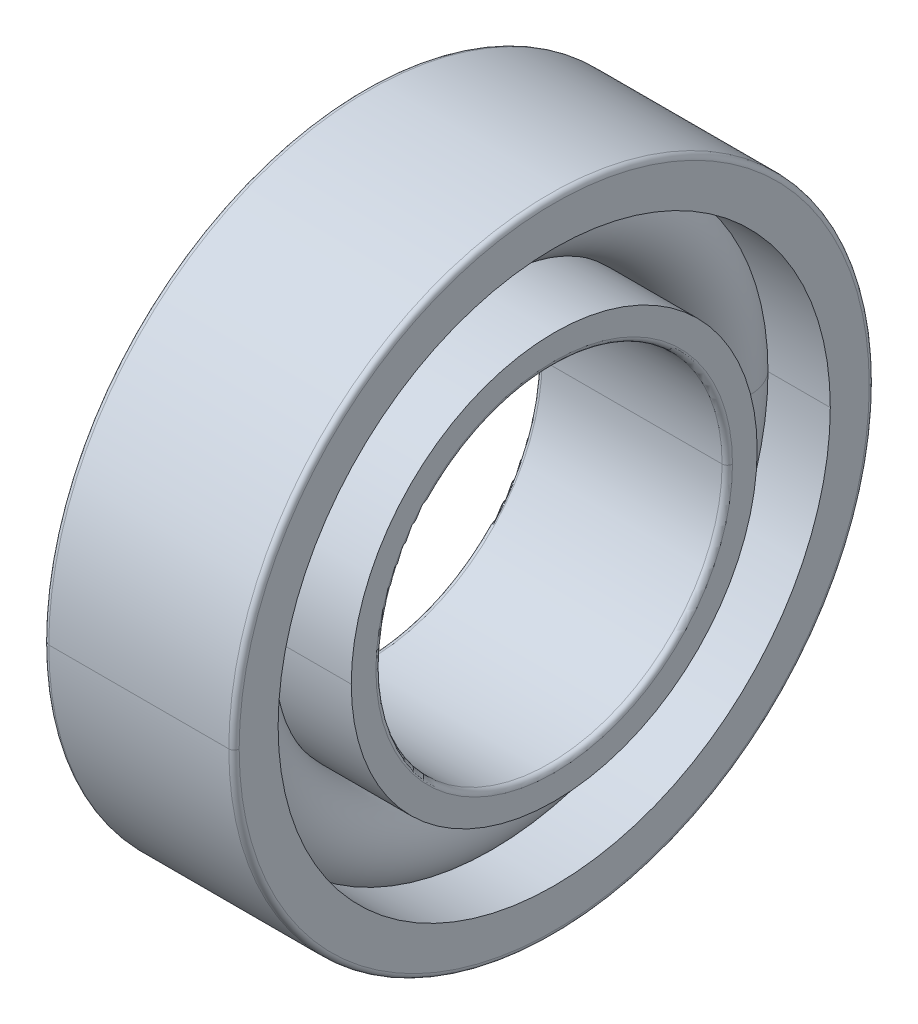
ISO-10303-21;
HEADER;
FILE_DESCRIPTION(('STEP AP214'),'2;1');
FILE_NAME('part.step','',(''),(''),'','','');
FILE_SCHEMA(('AUTOMOTIVE_DESIGN { 1 0 10303 214 1 1 1 1 }'));
ENDSEC;
DATA;
#1=APPLICATION_CONTEXT('core data for automotive mechanical design processes');
#2=APPLICATION_PROTOCOL_DEFINITION('international standard','automotive_design',2000,#1);
#3=PRODUCT_CONTEXT('',#1,'mechanical');
#4=PRODUCT('Part','Part','',(#3));
#5=PRODUCT_RELATED_PRODUCT_CATEGORY('part','',(#4));
#6=PRODUCT_DEFINITION_FORMATION('','',#4);
#7=PRODUCT_DEFINITION_CONTEXT('part definition',#1,'design');
#8=PRODUCT_DEFINITION('design','',#6,#7);
#9=PRODUCT_DEFINITION_SHAPE('','',#8);
#10=(LENGTH_UNIT() NAMED_UNIT(*) SI_UNIT(.MILLI.,.METRE.));
#11=(NAMED_UNIT(*) PLANE_ANGLE_UNIT() SI_UNIT($,.RADIAN.));
#12=(NAMED_UNIT(*) SI_UNIT($,.STERADIAN.) SOLID_ANGLE_UNIT());
#13=UNCERTAINTY_MEASURE_WITH_UNIT(LENGTH_MEASURE(1.E-05),#10,'distance_accuracy_value','');
#14=(GEOMETRIC_REPRESENTATION_CONTEXT(3) GLOBAL_UNCERTAINTY_ASSIGNED_CONTEXT((#13)) GLOBAL_UNIT_ASSIGNED_CONTEXT((#10,
#11,#12)) REPRESENTATION_CONTEXT('',''));
#15=CARTESIAN_POINT('',(0.,0.,0.));
#16=DIRECTION('',(0.,0.,1.));
#17=DIRECTION('',(1.,0.,0.));
#18=AXIS2_PLACEMENT_3D('',#15,#16,#17);
#19=CARTESIAN_POINT('',(-5.5,16.775,0.));
#20=DIRECTION('',(-1.,0.,0.));
#21=DIRECTION('',(0.,0.,1.));
#22=AXIS2_PLACEMENT_3D('',#19,#20,#21);
#23=PLANE('',#22);
#24=CARTESIAN_POINT('',(-5.5,0.,0.));
#25=DIRECTION('',(1.,0.,0.));
#26=DIRECTION('',(0.,0.,-1.));
#27=AXIS2_PLACEMENT_3D('',#24,#25,#26);
#28=CIRCLE('',#27,16.775);
#29=CARTESIAN_POINT('',(-5.5,0.,-16.775));
#30=VERTEX_POINT('',#29);
#31=CARTESIAN_POINT('',(-5.5,0.,16.775));
#32=VERTEX_POINT('',#31);
#33=EDGE_CURVE('E216',#30,#32,#28,.T.);
#34=ORIENTED_EDGE('',*,*,#33,.T.);
#35=CARTESIAN_POINT('',(-5.5,0.,0.));
#36=DIRECTION('',(1.,0.,0.));
#37=DIRECTION('',(0.,0.,-1.));
#38=AXIS2_PLACEMENT_3D('',#35,#36,#37);
#39=CIRCLE('',#38,16.775);
#40=EDGE_CURVE('E164',#32,#30,#39,.T.);
#41=ORIENTED_EDGE('',*,*,#40,.T.);
#42=EDGE_LOOP('',(#34,#41));
#43=FACE_BOUND('',#42,.T.);
#44=CARTESIAN_POINT('',(-5.5,0.,0.));
#45=DIRECTION('',(1.,0.,0.));
#46=DIRECTION('',(0.,0.,-1.));
#47=AXIS2_PLACEMENT_3D('',#44,#45,#46);
#48=CIRCLE('',#47,18.2);
#49=CARTESIAN_POINT('',(-5.5,0.,-18.2));
#50=VERTEX_POINT('',#49);
#51=CARTESIAN_POINT('',(-5.5,0.,18.2));
#52=VERTEX_POINT('',#51);
#53=EDGE_CURVE('E153',#50,#52,#48,.T.);
#54=ORIENTED_EDGE('',*,*,#53,.F.);
#55=CARTESIAN_POINT('',(-5.5,0.,0.));
#56=DIRECTION('',(1.,0.,0.));
#57=DIRECTION('',(0.,0.,-1.));
#58=AXIS2_PLACEMENT_3D('',#55,#56,#57);
#59=CIRCLE('',#58,18.2);
#60=EDGE_CURVE('E212',#52,#50,#59,.T.);
#61=ORIENTED_EDGE('',*,*,#60,.F.);
#62=EDGE_LOOP('',(#54,#61));
#63=FACE_BOUND('',#62,.T.);
#64=ADVANCED_FACE('F17',(#43,#63),#23,.T.);
#65=CARTESIAN_POINT('',(5.5,18.2,0.));
#66=DIRECTION('',(1.,0.,0.));
#67=DIRECTION('',(0.,1.,0.));
#68=AXIS2_PLACEMENT_3D('',#65,#66,#67);
#69=PLANE('',#68);
#70=CARTESIAN_POINT('',(5.5,0.,0.));
#71=DIRECTION('',(1.,0.,0.));
#72=DIRECTION('',(0.,0.,-1.));
#73=AXIS2_PLACEMENT_3D('',#70,#71,#72);
#74=CIRCLE('',#73,15.95);
#75=CARTESIAN_POINT('',(5.5,0.,-15.95));
#76=VERTEX_POINT('',#75);
#77=CARTESIAN_POINT('',(5.5,0.,15.95));
#78=VERTEX_POINT('',#77);
#79=EDGE_CURVE('E194',#76,#78,#74,.T.);
#80=ORIENTED_EDGE('',*,*,#79,.F.);
#81=CARTESIAN_POINT('',(5.5,0.,0.));
#82=DIRECTION('',(1.,0.,0.));
#83=DIRECTION('',(0.,0.,-1.));
#84=AXIS2_PLACEMENT_3D('',#81,#82,#83);
#85=CIRCLE('',#84,15.95);
#86=EDGE_CURVE('E217',#78,#76,#85,.T.);
#87=ORIENTED_EDGE('',*,*,#86,.F.);
#88=EDGE_LOOP('',(#80,#87));
#89=FACE_BOUND('',#88,.T.);
#90=CARTESIAN_POINT('',(5.5,0.,0.));
#91=DIRECTION('',(1.,0.,0.));
#92=DIRECTION('',(0.,0.,-1.));
#93=AXIS2_PLACEMENT_3D('',#90,#91,#92);
#94=CIRCLE('',#93,18.2);
#95=CARTESIAN_POINT('',(5.5,0.,-18.2));
#96=VERTEX_POINT('',#95);
#97=CARTESIAN_POINT('',(5.5,0.,18.2));
#98=VERTEX_POINT('',#97);
#99=EDGE_CURVE('E190',#96,#98,#94,.T.);
#100=ORIENTED_EDGE('',*,*,#99,.T.);
#101=CARTESIAN_POINT('',(5.5,0.,0.));
#102=DIRECTION('',(1.,0.,0.));
#103=DIRECTION('',(0.,0.,-1.));
#104=AXIS2_PLACEMENT_3D('',#101,#102,#103);
#105=CIRCLE('',#104,18.2);
#106=EDGE_CURVE('E11',#98,#96,#105,.T.);
#107=ORIENTED_EDGE('',*,*,#106,.T.);
#108=EDGE_LOOP('',(#100,#107));
#109=FACE_BOUND('',#108,.T.);
#110=ADVANCED_FACE('F460',(#89,#109),#69,.T.);
#111=CARTESIAN_POINT('',(5.2,0.,0.));
#112=DIRECTION('',(1.,0.,0.));
#113=DIRECTION('',(0.,0.,-1.));
#114=AXIS2_PLACEMENT_3D('',#111,#112,#113);
#115=TOROIDAL_SURFACE('',#114,18.2,0.3);
#116=CARTESIAN_POINT('',(5.2,0.,18.2));
#117=DIRECTION('',(0.,1.,0.));
#118=DIRECTION('',(0.,0.,1.));
#119=AXIS2_PLACEMENT_3D('',#116,#117,#118);
#120=CIRCLE('',#119,0.3);
#121=CARTESIAN_POINT('',(5.2,0.,18.5));
#122=VERTEX_POINT('',#121);
#123=EDGE_CURVE('E179',#122,#98,#120,.T.);
#124=ORIENTED_EDGE('',*,*,#123,.F.);
#125=CARTESIAN_POINT('',(5.2,0.,0.));
#126=DIRECTION('',(1.,0.,0.));
#127=DIRECTION('',(0.,0.,-1.));
#128=AXIS2_PLACEMENT_3D('',#125,#126,#127);
#129=CIRCLE('',#128,18.5);
#130=CARTESIAN_POINT('',(5.2,0.,-18.5));
#131=VERTEX_POINT('',#130);
#132=EDGE_CURVE('E27',#122,#131,#129,.T.);
#133=ORIENTED_EDGE('',*,*,#132,.T.);
#134=CARTESIAN_POINT('',(5.2,0.,-18.2));
#135=DIRECTION('',(0.,-1.,0.));
#136=DIRECTION('',(0.,0.,-1.));
#137=AXIS2_PLACEMENT_3D('',#134,#135,#136);
#138=CIRCLE('',#137,0.3);
#139=EDGE_CURVE('E185',#131,#96,#138,.T.);
#140=ORIENTED_EDGE('',*,*,#139,.T.);
#141=ORIENTED_EDGE('',*,*,#106,.F.);
#142=EDGE_LOOP('',(#124,#133,#140,#141));
#143=FACE_BOUND('',#142,.T.);
#144=ADVANCED_FACE('F401',(#143),#115,.T.);
#145=CARTESIAN_POINT('',(-20.6375,0.,0.));
#146=DIRECTION('',(1.,0.,0.));
#147=DIRECTION('',(0.,0.,-1.));
#148=AXIS2_PLACEMENT_3D('',#145,#146,#147);
#149=CYLINDRICAL_SURFACE('',#148,18.5);
#150=DIRECTION('',(1.,0.,0.));
#151=VECTOR('',#150,1.);
#152=CARTESIAN_POINT('',(-20.6375,0.,18.5));
#153=LINE('',#152,#151);
#154=CARTESIAN_POINT('',(-5.2,0.,18.5));
#155=VERTEX_POINT('',#154);
#156=EDGE_CURVE('E226',#155,#122,#153,.T.);
#157=ORIENTED_EDGE('',*,*,#156,.F.);
#158=CARTESIAN_POINT('',(-5.2,0.,0.));
#159=DIRECTION('',(1.,0.,0.));
#160=DIRECTION('',(0.,0.,-1.));
#161=AXIS2_PLACEMENT_3D('',#158,#159,#160);
#162=CIRCLE('',#161,18.5);
#163=CARTESIAN_POINT('',(-5.2,0.,-18.5));
#164=VERTEX_POINT('',#163);
#165=EDGE_CURVE('E211',#155,#164,#162,.T.);
#166=ORIENTED_EDGE('',*,*,#165,.T.);
#167=DIRECTION('',(1.,0.,0.));
#168=VECTOR('',#167,1.);
#169=CARTESIAN_POINT('',(-20.6375,0.,-18.5));
#170=LINE('',#169,#168);
#171=EDGE_CURVE('E158',#164,#131,#170,.T.);
#172=ORIENTED_EDGE('',*,*,#171,.T.);
#173=ORIENTED_EDGE('',*,*,#132,.F.);
#174=EDGE_LOOP('',(#157,#166,#172,#173));
#175=FACE_BOUND('',#174,.T.);
#176=ADVANCED_FACE('F407',(#175),#149,.T.);
#177=CARTESIAN_POINT('',(-5.2,0.,0.));
#178=DIRECTION('',(1.,0.,0.));
#179=DIRECTION('',(0.,0.,-1.));
#180=AXIS2_PLACEMENT_3D('',#177,#178,#179);
#181=TOROIDAL_SURFACE('',#180,18.2,0.3);
#182=CARTESIAN_POINT('',(-5.2,0.,18.2));
#183=DIRECTION('',(0.,1.,0.));
#184=DIRECTION('',(0.,0.,1.));
#185=AXIS2_PLACEMENT_3D('',#182,#183,#184);
#186=CIRCLE('',#185,0.3);
#187=EDGE_CURVE('E157',#52,#155,#186,.T.);
#188=ORIENTED_EDGE('',*,*,#187,.F.);
#189=ORIENTED_EDGE('',*,*,#60,.T.);
#190=CARTESIAN_POINT('',(-5.2,0.,-18.2));
#191=DIRECTION('',(0.,-1.,0.));
#192=DIRECTION('',(0.,0.,-1.));
#193=AXIS2_PLACEMENT_3D('',#190,#191,#192);
#194=CIRCLE('',#193,0.3);
#195=EDGE_CURVE('E207',#50,#164,#194,.T.);
#196=ORIENTED_EDGE('',*,*,#195,.T.);
#197=ORIENTED_EDGE('',*,*,#165,.F.);
#198=EDGE_LOOP('',(#188,#189,#196,#197));
#199=FACE_BOUND('',#198,.T.);
#200=ADVANCED_FACE('F473',(#199),#181,.T.);
#201=CARTESIAN_POINT('',(-20.6375,0.,0.));
#202=DIRECTION('',(1.,0.,0.));
#203=DIRECTION('',(0.,0.,-1.));
#204=AXIS2_PLACEMENT_3D('',#201,#202,#203);
#205=CYLINDRICAL_SURFACE('',#204,16.775);
#206=DIRECTION('',(1.,0.,0.));
#207=VECTOR('',#206,1.);
#208=CARTESIAN_POINT('',(-20.6375,0.,16.775));
#209=LINE('',#208,#207);
#210=CARTESIAN_POINT('',(-0.356195171219364,0.,16.775));
#211=VERTEX_POINT('',#210);
#212=EDGE_CURVE('E159',#32,#211,#209,.T.);
#213=ORIENTED_EDGE('',*,*,#212,.F.);
#214=ORIENTED_EDGE('',*,*,#33,.F.);
#215=DIRECTION('',(1.,0.,0.));
#216=VECTOR('',#215,1.);
#217=CARTESIAN_POINT('',(-20.6375,0.,-16.775));
#218=LINE('',#217,#216);
#219=CARTESIAN_POINT('',(-0.356195171219364,0.,-16.775));
#220=VERTEX_POINT('',#219);
#221=EDGE_CURVE('E238',#30,#220,#218,.T.);
#222=ORIENTED_EDGE('',*,*,#221,.T.);
#223=CARTESIAN_POINT('',(-0.356195171219364,0.,0.));
#224=DIRECTION('',(-1.,0.,0.));
#225=DIRECTION('',(0.,0.,-1.));
#226=AXIS2_PLACEMENT_3D('',#223,#224,#225);
#227=CIRCLE('',#226,16.775);
#228=EDGE_CURVE('E202',#211,#220,#227,.T.);
#229=ORIENTED_EDGE('',*,*,#228,.F.);
#230=EDGE_LOOP('',(#213,#214,#222,#229));
#231=FACE_BOUND('',#230,.T.);
#232=ADVANCED_FACE('F475',(#231),#205,.F.);
#233=CARTESIAN_POINT('',(-20.6375,0.,0.));
#234=DIRECTION('',(1.,0.,0.));
#235=DIRECTION('',(0.,0.,-1.));
#236=AXIS2_PLACEMENT_3D('',#233,#234,#235);
#237=CYLINDRICAL_SURFACE('',#236,15.95);
#238=DIRECTION('',(1.,0.,0.));
#239=VECTOR('',#238,1.);
#240=CARTESIAN_POINT('',(-20.6375,0.,15.95));
#241=LINE('',#240,#239);
#242=CARTESIAN_POINT('',(1.90065778087482,0.,15.95));
#243=VERTEX_POINT('',#242);
#244=EDGE_CURVE('E222',#243,#78,#241,.T.);
#245=ORIENTED_EDGE('',*,*,#244,.F.);
#246=CARTESIAN_POINT('',(1.90065778087482,0.,0.));
#247=DIRECTION('',(1.,0.,0.));
#248=DIRECTION('',(0.,0.,1.));
#249=AXIS2_PLACEMENT_3D('',#246,#247,#248);
#250=CIRCLE('',#249,15.95);
#251=CARTESIAN_POINT('',(1.90065778087482,0.,-15.95));
#252=VERTEX_POINT('',#251);
#253=EDGE_CURVE('E174',#252,#243,#250,.T.);
#254=ORIENTED_EDGE('',*,*,#253,.F.);
#255=DIRECTION('',(1.,0.,0.));
#256=VECTOR('',#255,1.);
#257=CARTESIAN_POINT('',(-20.6375,0.,-15.95));
#258=LINE('',#257,#256);
#259=EDGE_CURVE('E221',#252,#76,#258,.T.);
#260=ORIENTED_EDGE('',*,*,#259,.T.);
#261=ORIENTED_EDGE('',*,*,#79,.T.);
#262=EDGE_LOOP('',(#245,#254,#260,#261));
#263=FACE_BOUND('',#262,.T.);
#264=ADVANCED_FACE('F481',(#263),#237,.F.);
#265=CARTESIAN_POINT('',(0.,0.,0.));
#266=DIRECTION('',(-1.,0.,0.));
#267=DIRECTION('',(0.,0.,1.));
#268=AXIS2_PLACEMENT_3D('',#265,#266,#267);
#269=TOROIDAL_SURFACE('',#268,14.25,2.55);
#270=CARTESIAN_POINT('',(0.,0.,-14.25));
#271=DIRECTION('',(0.,1.,0.));
#272=DIRECTION('',(0.,0.,1.));
#273=AXIS2_PLACEMENT_3D('',#270,#271,#272);
#274=CIRCLE('',#273,2.55);
#275=CARTESIAN_POINT('',(-1.90065778087482,0.,-12.55));
#276=VERTEX_POINT('',#275);
#277=EDGE_CURVE('E198',#220,#276,#274,.T.);
#278=ORIENTED_EDGE('',*,*,#277,.F.);
#279=CARTESIAN_POINT('',(-0.356195171219364,0.,0.));
#280=DIRECTION('',(-1.,0.,0.));
#281=DIRECTION('',(0.,0.,-1.));
#282=AXIS2_PLACEMENT_3D('',#279,#280,#281);
#283=CIRCLE('',#282,16.775);
#284=EDGE_CURVE('E163',#220,#211,#283,.T.);
#285=ORIENTED_EDGE('',*,*,#284,.T.);
#286=CARTESIAN_POINT('',(0.,0.,14.25));
#287=DIRECTION('',(0.,-1.,0.));
#288=DIRECTION('',(0.,0.,-1.));
#289=AXIS2_PLACEMENT_3D('',#286,#287,#288);
#290=CIRCLE('',#289,2.55);
#291=CARTESIAN_POINT('',(-1.90065778087482,0.,12.55));
#292=VERTEX_POINT('',#291);
#293=EDGE_CURVE('E252',#211,#292,#290,.T.);
#294=ORIENTED_EDGE('',*,*,#293,.T.);
#295=CARTESIAN_POINT('',(-1.90065778087482,0.,0.));
#296=DIRECTION('',(1.,0.,0.));
#297=DIRECTION('',(0.,0.,-1.));
#298=AXIS2_PLACEMENT_3D('',#295,#296,#297);
#299=CIRCLE('',#298,12.55);
#300=EDGE_CURVE('E147',#292,#276,#299,.T.);
#301=ORIENTED_EDGE('',*,*,#300,.T.);
#302=EDGE_LOOP('',(#278,#285,#294,#301));
#303=FACE_BOUND('',#302,.T.);
#304=ADVANCED_FACE('F347',(#303),#269,.T.);
#305=CARTESIAN_POINT('',(-5.5,12.55,0.));
#306=DIRECTION('',(-1.,0.,0.));
#307=DIRECTION('',(0.,0.,1.));
#308=AXIS2_PLACEMENT_3D('',#305,#306,#307);
#309=PLANE('',#308);
#310=CARTESIAN_POINT('',(-5.5,0.,0.));
#311=DIRECTION('',(1.,0.,0.));
#312=DIRECTION('',(0.,0.,-1.));
#313=AXIS2_PLACEMENT_3D('',#310,#311,#312);
#314=CIRCLE('',#313,10.3);
#315=CARTESIAN_POINT('',(-5.5,0.,-10.3));
#316=VERTEX_POINT('',#315);
#317=CARTESIAN_POINT('',(-5.5,0.,10.3));
#318=VERTEX_POINT('',#317);
#319=EDGE_CURVE('E275',#316,#318,#314,.T.);
#320=ORIENTED_EDGE('',*,*,#319,.T.);
#321=CARTESIAN_POINT('',(-5.5,0.,0.));
#322=DIRECTION('',(1.,0.,0.));
#323=DIRECTION('',(0.,0.,-1.));
#324=AXIS2_PLACEMENT_3D('',#321,#322,#323);
#325=CIRCLE('',#324,10.3);
#326=EDGE_CURVE('E191',#318,#316,#325,.T.);
#327=ORIENTED_EDGE('',*,*,#326,.T.);
#328=EDGE_LOOP('',(#320,#327));
#329=FACE_BOUND('',#328,.T.);
#330=CARTESIAN_POINT('',(-5.5,0.,0.));
#331=DIRECTION('',(1.,0.,0.));
#332=DIRECTION('',(0.,0.,-1.));
#333=AXIS2_PLACEMENT_3D('',#330,#331,#332);
#334=CIRCLE('',#333,12.55);
#335=CARTESIAN_POINT('',(-5.5,0.,-12.55));
#336=VERTEX_POINT('',#335);
#337=CARTESIAN_POINT('',(-5.5,0.,12.55));
#338=VERTEX_POINT('',#337);
#339=EDGE_CURVE('E180',#336,#338,#334,.T.);
#340=ORIENTED_EDGE('',*,*,#339,.F.);
#341=CARTESIAN_POINT('',(-5.5,0.,0.));
#342=DIRECTION('',(1.,0.,0.));
#343=DIRECTION('',(0.,0.,-1.));
#344=AXIS2_PLACEMENT_3D('',#341,#342,#343);
#345=CIRCLE('',#344,12.55);
#346=EDGE_CURVE('E323',#338,#336,#345,.T.);
#347=ORIENTED_EDGE('',*,*,#346,.F.);
#348=EDGE_LOOP('',(#340,#347));
#349=FACE_BOUND('',#348,.T.);
#350=ADVANCED_FACE('F344',(#329,#349),#309,.T.);
#351=CARTESIAN_POINT('',(-5.2,0.,0.));
#352=DIRECTION('',(1.,0.,0.));
#353=DIRECTION('',(0.,0.,-1.));
#354=AXIS2_PLACEMENT_3D('',#351,#352,#353);
#355=TOROIDAL_SURFACE('',#354,10.3,0.3);
#356=CARTESIAN_POINT('',(-5.2,0.,10.3));
#357=DIRECTION('',(0.,1.,0.));
#358=DIRECTION('',(0.,0.,1.));
#359=AXIS2_PLACEMENT_3D('',#356,#357,#358);
#360=CIRCLE('',#359,0.299999999999996);
#361=CARTESIAN_POINT('',(-5.2,0.,10.));
#362=VERTEX_POINT('',#361);
#363=EDGE_CURVE('E251',#362,#318,#360,.T.);
#364=ORIENTED_EDGE('',*,*,#363,.F.);
#365=CARTESIAN_POINT('',(-5.2,0.,0.));
#366=DIRECTION('',(1.,0.,0.));
#367=DIRECTION('',(0.,0.,-1.));
#368=AXIS2_PLACEMENT_3D('',#365,#366,#367);
#369=CIRCLE('',#368,10.);
#370=CARTESIAN_POINT('',(-5.2,0.,-10.));
#371=VERTEX_POINT('',#370);
#372=EDGE_CURVE('E134',#362,#371,#369,.T.);
#373=ORIENTED_EDGE('',*,*,#372,.T.);
#374=CARTESIAN_POINT('',(-5.2,0.,-10.3));
#375=DIRECTION('',(0.,-1.,0.));
#376=DIRECTION('',(0.,0.,-1.));
#377=AXIS2_PLACEMENT_3D('',#374,#375,#376);
#378=CIRCLE('',#377,0.299999999999996);
#379=EDGE_CURVE('E143',#371,#316,#378,.T.);
#380=ORIENTED_EDGE('',*,*,#379,.T.);
#381=ORIENTED_EDGE('',*,*,#326,.F.);
#382=EDGE_LOOP('',(#364,#373,#380,#381));
#383=FACE_BOUND('',#382,.T.);
#384=ADVANCED_FACE('F340',(#383),#355,.T.);
#385=CARTESIAN_POINT('',(-20.6375,0.,0.));
#386=DIRECTION('',(1.,0.,0.));
#387=DIRECTION('',(0.,0.,-1.));
#388=AXIS2_PLACEMENT_3D('',#385,#386,#387);
#389=CYLINDRICAL_SURFACE('',#388,10.);
#390=DIRECTION('',(1.,0.,0.));
#391=VECTOR('',#390,1.);
#392=CARTESIAN_POINT('',(-20.6375,0.,10.));
#393=LINE('',#392,#391);
#394=CARTESIAN_POINT('',(5.2,0.,10.));
#395=VERTEX_POINT('',#394);
#396=EDGE_CURVE('E108',#362,#395,#393,.T.);
#397=ORIENTED_EDGE('',*,*,#396,.F.);
#398=CARTESIAN_POINT('',(-5.2,0.,0.));
#399=DIRECTION('',(1.,0.,0.));
#400=DIRECTION('',(0.,0.,-1.));
#401=AXIS2_PLACEMENT_3D('',#398,#399,#400);
#402=CIRCLE('',#401,10.);
#403=EDGE_CURVE('E247',#371,#362,#402,.T.);
#404=ORIENTED_EDGE('',*,*,#403,.F.);
#405=DIRECTION('',(1.,0.,0.));
#406=VECTOR('',#405,1.);
#407=CARTESIAN_POINT('',(-20.6375,0.,-10.));
#408=LINE('',#407,#406);
#409=CARTESIAN_POINT('',(5.2,0.,-10.));
#410=VERTEX_POINT('',#409);
#411=EDGE_CURVE('E111',#371,#410,#408,.T.);
#412=ORIENTED_EDGE('',*,*,#411,.T.);
#413=CARTESIAN_POINT('',(5.2,0.,0.));
#414=DIRECTION('',(1.,0.,0.));
#415=DIRECTION('',(0.,0.,-1.));
#416=AXIS2_PLACEMENT_3D('',#413,#414,#415);
#417=CIRCLE('',#416,10.);
#418=EDGE_CURVE('E103',#410,#395,#417,.T.);
#419=ORIENTED_EDGE('',*,*,#418,.T.);
#420=EDGE_LOOP('',(#397,#404,#412,#419));
#421=FACE_BOUND('',#420,.T.);
#422=ADVANCED_FACE('F105',(#421),#389,.F.);
#423=CARTESIAN_POINT('',(5.2,0.,0.));
#424=DIRECTION('',(1.,0.,0.));
#425=DIRECTION('',(0.,0.,-1.));
#426=AXIS2_PLACEMENT_3D('',#423,#424,#425);
#427=TOROIDAL_SURFACE('',#426,10.3,0.3);
#428=CARTESIAN_POINT('',(5.2,0.,10.3));
#429=DIRECTION('',(0.,1.,0.));
#430=DIRECTION('',(0.,0.,1.));
#431=AXIS2_PLACEMENT_3D('',#428,#429,#430);
#432=CIRCLE('',#431,0.299999999999996);
#433=CARTESIAN_POINT('',(5.5,0.,10.3));
#434=VERTEX_POINT('',#433);
#435=EDGE_CURVE('E116',#434,#395,#432,.T.);
#436=ORIENTED_EDGE('',*,*,#435,.F.);
#437=CARTESIAN_POINT('',(5.5,0.,0.));
#438=DIRECTION('',(1.,0.,0.));
#439=DIRECTION('',(0.,0.,-1.));
#440=AXIS2_PLACEMENT_3D('',#437,#438,#439);
#441=CIRCLE('',#440,10.3);
#442=CARTESIAN_POINT('',(5.5,0.,-10.3));
#443=VERTEX_POINT('',#442);
#444=EDGE_CURVE('E195',#434,#443,#441,.T.);
#445=ORIENTED_EDGE('',*,*,#444,.T.);
#446=CARTESIAN_POINT('',(5.2,0.,-10.3));
#447=DIRECTION('',(0.,-1.,0.));
#448=DIRECTION('',(0.,0.,-1.));
#449=AXIS2_PLACEMENT_3D('',#446,#447,#448);
#450=CIRCLE('',#449,0.299999999999996);
#451=EDGE_CURVE('E20',#443,#410,#450,.T.);
#452=ORIENTED_EDGE('',*,*,#451,.T.);
#453=CARTESIAN_POINT('',(5.2,0.,0.));
#454=DIRECTION('',(1.,0.,0.));
#455=DIRECTION('',(0.,0.,-1.));
#456=AXIS2_PLACEMENT_3D('',#453,#454,#455);
#457=CIRCLE('',#456,10.);
#458=EDGE_CURVE('E127',#395,#410,#457,.T.);
#459=ORIENTED_EDGE('',*,*,#458,.F.);
#460=EDGE_LOOP('',(#436,#445,#452,#459));
#461=FACE_BOUND('',#460,.T.);
#462=ADVANCED_FACE('F128',(#461),#427,.T.);
#463=CARTESIAN_POINT('',(5.5,10.3,0.));
#464=DIRECTION('',(1.,0.,0.));
#465=DIRECTION('',(0.,1.,0.));
#466=AXIS2_PLACEMENT_3D('',#463,#464,#465);
#467=PLANE('',#466);
#468=CARTESIAN_POINT('',(5.5,0.,0.));
#469=DIRECTION('',(1.,0.,0.));
#470=DIRECTION('',(0.,0.,-1.));
#471=AXIS2_PLACEMENT_3D('',#468,#469,#470);
#472=CIRCLE('',#471,10.3);
#473=EDGE_CURVE('E122',#443,#434,#472,.T.);
#474=ORIENTED_EDGE('',*,*,#473,.F.);
#475=ORIENTED_EDGE('',*,*,#444,.F.);
#476=EDGE_LOOP('',(#474,#475));
#477=FACE_BOUND('',#476,.T.);
#478=CARTESIAN_POINT('',(5.5,0.,0.));
#479=DIRECTION('',(1.,0.,0.));
#480=DIRECTION('',(0.,0.,-1.));
#481=AXIS2_PLACEMENT_3D('',#478,#479,#480);
#482=CIRCLE('',#481,11.725);
#483=CARTESIAN_POINT('',(5.5,0.,-11.725));
#484=VERTEX_POINT('',#483);
#485=CARTESIAN_POINT('',(5.5,0.,11.725));
#486=VERTEX_POINT('',#485);
#487=EDGE_CURVE('E149',#484,#486,#482,.T.);
#488=ORIENTED_EDGE('',*,*,#487,.T.);
#489=CARTESIAN_POINT('',(5.5,0.,0.));
#490=DIRECTION('',(1.,0.,0.));
#491=DIRECTION('',(0.,0.,-1.));
#492=AXIS2_PLACEMENT_3D('',#489,#490,#491);
#493=CIRCLE('',#492,11.725);
#494=EDGE_CURVE('E41',#486,#484,#493,.T.);
#495=ORIENTED_EDGE('',*,*,#494,.T.);
#496=EDGE_LOOP('',(#488,#495));
#497=FACE_BOUND('',#496,.T.);
#498=ADVANCED_FACE('F429',(#477,#497),#467,.T.);
#499=CARTESIAN_POINT('',(-20.6375,0.,0.));
#500=DIRECTION('',(1.,0.,0.));
#501=DIRECTION('',(0.,0.,-1.));
#502=AXIS2_PLACEMENT_3D('',#499,#500,#501);
#503=CYLINDRICAL_SURFACE('',#502,12.55);
#504=DIRECTION('',(1.,0.,0.));
#505=VECTOR('',#504,1.);
#506=CARTESIAN_POINT('',(-20.6375,0.,12.55));
#507=LINE('',#506,#505);
#508=EDGE_CURVE('E184',#338,#292,#507,.T.);
#509=ORIENTED_EDGE('',*,*,#508,.F.);
#510=ORIENTED_EDGE('',*,*,#346,.T.);
#511=DIRECTION('',(1.,0.,0.));
#512=VECTOR('',#511,1.);
#513=CARTESIAN_POINT('',(-20.6375,0.,-12.55));
#514=LINE('',#513,#512);
#515=EDGE_CURVE('E169',#336,#276,#514,.T.);
#516=ORIENTED_EDGE('',*,*,#515,.T.);
#517=ORIENTED_EDGE('',*,*,#300,.F.);
#518=EDGE_LOOP('',(#509,#510,#516,#517));
#519=FACE_BOUND('',#518,.T.);
#520=ADVANCED_FACE('F431',(#519),#503,.T.);
#521=CARTESIAN_POINT('',(-20.6375,0.,0.));
#522=DIRECTION('',(1.,0.,0.));
#523=DIRECTION('',(0.,0.,-1.));
#524=AXIS2_PLACEMENT_3D('',#521,#522,#523);
#525=CYLINDRICAL_SURFACE('',#524,11.725);
#526=DIRECTION('',(1.,0.,0.));
#527=VECTOR('',#526,1.);
#528=CARTESIAN_POINT('',(-20.6375,0.,11.725));
#529=LINE('',#528,#527);
#530=CARTESIAN_POINT('',(0.356195171219364,0.,11.725));
#531=VERTEX_POINT('',#530);
#532=EDGE_CURVE('E152',#531,#486,#529,.T.);
#533=ORIENTED_EDGE('',*,*,#532,.F.);
#534=CARTESIAN_POINT('',(0.356195171219364,0.,0.));
#535=DIRECTION('',(-1.,0.,0.));
#536=DIRECTION('',(0.,0.,1.));
#537=AXIS2_PLACEMENT_3D('',#534,#535,#536);
#538=CIRCLE('',#537,11.725);
#539=CARTESIAN_POINT('',(0.356195171219364,0.,-11.725));
#540=VERTEX_POINT('',#539);
#541=EDGE_CURVE('E293',#540,#531,#538,.T.);
#542=ORIENTED_EDGE('',*,*,#541,.F.);
#543=DIRECTION('',(1.,0.,0.));
#544=VECTOR('',#543,1.);
#545=CARTESIAN_POINT('',(-20.6375,0.,-11.725));
#546=LINE('',#545,#544);
#547=EDGE_CURVE('E151',#540,#484,#546,.T.);
#548=ORIENTED_EDGE('',*,*,#547,.T.);
#549=ORIENTED_EDGE('',*,*,#494,.F.);
#550=EDGE_LOOP('',(#533,#542,#548,#549));
#551=FACE_BOUND('',#550,.T.);
#552=ADVANCED_FACE('F440',(#551),#525,.T.);
#553=CARTESIAN_POINT('',(0.,0.,0.));
#554=DIRECTION('',(-1.,0.,0.));
#555=DIRECTION('',(0.,0.,1.));
#556=AXIS2_PLACEMENT_3D('',#553,#554,#555);
#557=TOROIDAL_SURFACE('',#556,14.25,2.55);
#558=CARTESIAN_POINT('',(0.,0.,-14.25));
#559=DIRECTION('',(0.,1.,0.));
#560=DIRECTION('',(0.,0.,1.));
#561=AXIS2_PLACEMENT_3D('',#558,#559,#560);
#562=CIRCLE('',#561,2.55);
#563=EDGE_CURVE('E170',#540,#252,#562,.T.);
#564=ORIENTED_EDGE('',*,*,#563,.F.);
#565=ORIENTED_EDGE('',*,*,#541,.T.);
#566=CARTESIAN_POINT('',(0.,0.,14.25));
#567=DIRECTION('',(0.,-1.,0.));
#568=DIRECTION('',(0.,0.,-1.));
#569=AXIS2_PLACEMENT_3D('',#566,#567,#568);
#570=CIRCLE('',#569,2.55);
#571=EDGE_CURVE('E290',#531,#243,#570,.T.);
#572=ORIENTED_EDGE('',*,*,#571,.T.);
#573=CARTESIAN_POINT('',(1.90065778087482,0.,0.));
#574=DIRECTION('',(1.,0.,0.));
#575=DIRECTION('',(0.,0.,1.));
#576=AXIS2_PLACEMENT_3D('',#573,#574,#575);
#577=CIRCLE('',#576,15.95);
#578=EDGE_CURVE('E246',#243,#252,#577,.T.);
#579=ORIENTED_EDGE('',*,*,#578,.T.);
#580=EDGE_LOOP('',(#564,#565,#572,#579));
#581=FACE_BOUND('',#580,.T.);
#582=ADVANCED_FACE('F449',(#581),#557,.T.);
#583=CARTESIAN_POINT('',(0.,0.,0.));
#584=DIRECTION('',(-1.,0.,0.));
#585=DIRECTION('',(0.,0.,1.));
#586=AXIS2_PLACEMENT_3D('',#583,#584,#585);
#587=TOROIDAL_SURFACE('',#586,14.25,2.55);
#588=CARTESIAN_POINT('',(0.356195171219364,0.,0.));
#589=DIRECTION('',(-1.,0.,0.));
#590=DIRECTION('',(0.,0.,1.));
#591=AXIS2_PLACEMENT_3D('',#588,#589,#590);
#592=CIRCLE('',#591,11.725);
#593=EDGE_CURVE('E165',#531,#540,#592,.T.);
#594=ORIENTED_EDGE('',*,*,#593,.T.);
#595=ORIENTED_EDGE('',*,*,#563,.T.);
#596=ORIENTED_EDGE('',*,*,#253,.T.);
#597=ORIENTED_EDGE('',*,*,#571,.F.);
#598=EDGE_LOOP('',(#594,#595,#596,#597));
#599=FACE_BOUND('',#598,.T.);
#600=ADVANCED_FACE('F442',(#599),#587,.T.);
#601=CARTESIAN_POINT('',(-20.6375,0.,0.));
#602=DIRECTION('',(1.,0.,0.));
#603=DIRECTION('',(0.,0.,-1.));
#604=AXIS2_PLACEMENT_3D('',#601,#602,#603);
#605=CYLINDRICAL_SURFACE('',#604,11.725);
#606=ORIENTED_EDGE('',*,*,#593,.F.);
#607=ORIENTED_EDGE('',*,*,#532,.T.);
#608=ORIENTED_EDGE('',*,*,#487,.F.);
#609=ORIENTED_EDGE('',*,*,#547,.F.);
#610=EDGE_LOOP('',(#606,#607,#608,#609));
#611=FACE_BOUND('',#610,.T.);
#612=ADVANCED_FACE('F438',(#611),#605,.T.);
#613=CARTESIAN_POINT('',(-20.6375,0.,0.));
#614=DIRECTION('',(1.,0.,0.));
#615=DIRECTION('',(0.,0.,-1.));
#616=AXIS2_PLACEMENT_3D('',#613,#614,#615);
#617=CYLINDRICAL_SURFACE('',#616,12.55);
#618=ORIENTED_EDGE('',*,*,#339,.T.);
#619=ORIENTED_EDGE('',*,*,#508,.T.);
#620=CARTESIAN_POINT('',(-1.90065778087482,0.,0.));
#621=DIRECTION('',(1.,0.,0.));
#622=DIRECTION('',(0.,0.,-1.));
#623=AXIS2_PLACEMENT_3D('',#620,#621,#622);
#624=CIRCLE('',#623,12.55);
#625=EDGE_CURVE('E201',#276,#292,#624,.T.);
#626=ORIENTED_EDGE('',*,*,#625,.F.);
#627=ORIENTED_EDGE('',*,*,#515,.F.);
#628=EDGE_LOOP('',(#618,#619,#626,#627));
#629=FACE_BOUND('',#628,.T.);
#630=ADVANCED_FACE('F354',(#629),#617,.T.);
#631=CARTESIAN_POINT('',(5.2,0.,0.));
#632=DIRECTION('',(1.,0.,0.));
#633=DIRECTION('',(0.,0.,-1.));
#634=AXIS2_PLACEMENT_3D('',#631,#632,#633);
#635=TOROIDAL_SURFACE('',#634,10.3,0.3);
#636=ORIENTED_EDGE('',*,*,#473,.T.);
#637=ORIENTED_EDGE('',*,*,#435,.T.);
#638=ORIENTED_EDGE('',*,*,#418,.F.);
#639=ORIENTED_EDGE('',*,*,#451,.F.);
#640=EDGE_LOOP('',(#636,#637,#638,#639));
#641=FACE_BOUND('',#640,.T.);
#642=ADVANCED_FACE('F120',(#641),#635,.T.);
#643=CARTESIAN_POINT('',(-20.6375,0.,0.));
#644=DIRECTION('',(1.,0.,0.));
#645=DIRECTION('',(0.,0.,-1.));
#646=AXIS2_PLACEMENT_3D('',#643,#644,#645);
#647=CYLINDRICAL_SURFACE('',#646,10.);
#648=ORIENTED_EDGE('',*,*,#372,.F.);
#649=ORIENTED_EDGE('',*,*,#396,.T.);
#650=ORIENTED_EDGE('',*,*,#458,.T.);
#651=ORIENTED_EDGE('',*,*,#411,.F.);
#652=EDGE_LOOP('',(#648,#649,#650,#651));
#653=FACE_BOUND('',#652,.T.);
#654=ADVANCED_FACE('F132',(#653),#647,.F.);
#655=CARTESIAN_POINT('',(-5.2,0.,0.));
#656=DIRECTION('',(1.,0.,0.));
#657=DIRECTION('',(0.,0.,-1.));
#658=AXIS2_PLACEMENT_3D('',#655,#656,#657);
#659=TOROIDAL_SURFACE('',#658,10.3,0.3);
#660=ORIENTED_EDGE('',*,*,#403,.T.);
#661=ORIENTED_EDGE('',*,*,#363,.T.);
#662=ORIENTED_EDGE('',*,*,#319,.F.);
#663=ORIENTED_EDGE('',*,*,#379,.F.);
#664=EDGE_LOOP('',(#660,#661,#662,#663));
#665=FACE_BOUND('',#664,.T.);
#666=ADVANCED_FACE('F342',(#665),#659,.T.);
#667=CARTESIAN_POINT('',(0.,0.,0.));
#668=DIRECTION('',(-1.,0.,0.));
#669=DIRECTION('',(0.,0.,1.));
#670=AXIS2_PLACEMENT_3D('',#667,#668,#669);
#671=TOROIDAL_SURFACE('',#670,14.25,2.55);
#672=ORIENTED_EDGE('',*,*,#228,.T.);
#673=ORIENTED_EDGE('',*,*,#277,.T.);
#674=ORIENTED_EDGE('',*,*,#625,.T.);
#675=ORIENTED_EDGE('',*,*,#293,.F.);
#676=EDGE_LOOP('',(#672,#673,#674,#675));
#677=FACE_BOUND('',#676,.T.);
#678=ADVANCED_FACE('F501',(#677),#671,.T.);
#679=CARTESIAN_POINT('',(-20.6375,0.,0.));
#680=DIRECTION('',(1.,0.,0.));
#681=DIRECTION('',(0.,0.,-1.));
#682=AXIS2_PLACEMENT_3D('',#679,#680,#681);
#683=CYLINDRICAL_SURFACE('',#682,15.95);
#684=ORIENTED_EDGE('',*,*,#578,.F.);
#685=ORIENTED_EDGE('',*,*,#244,.T.);
#686=ORIENTED_EDGE('',*,*,#86,.T.);
#687=ORIENTED_EDGE('',*,*,#259,.F.);
#688=EDGE_LOOP('',(#684,#685,#686,#687));
#689=FACE_BOUND('',#688,.T.);
#690=ADVANCED_FACE('F446',(#689),#683,.F.);
#691=CARTESIAN_POINT('',(-20.6375,0.,0.));
#692=DIRECTION('',(1.,0.,0.));
#693=DIRECTION('',(0.,0.,-1.));
#694=AXIS2_PLACEMENT_3D('',#691,#692,#693);
#695=CYLINDRICAL_SURFACE('',#694,16.775);
#696=ORIENTED_EDGE('',*,*,#40,.F.);
#697=ORIENTED_EDGE('',*,*,#212,.T.);
#698=ORIENTED_EDGE('',*,*,#284,.F.);
#699=ORIENTED_EDGE('',*,*,#221,.F.);
#700=EDGE_LOOP('',(#696,#697,#698,#699));
#701=FACE_BOUND('',#700,.T.);
#702=ADVANCED_FACE('F491',(#701),#695,.F.);
#703=CARTESIAN_POINT('',(-5.2,0.,0.));
#704=DIRECTION('',(1.,0.,0.));
#705=DIRECTION('',(0.,0.,-1.));
#706=AXIS2_PLACEMENT_3D('',#703,#704,#705);
#707=TOROIDAL_SURFACE('',#706,18.2,0.3);
#708=ORIENTED_EDGE('',*,*,#53,.T.);
#709=ORIENTED_EDGE('',*,*,#187,.T.);
#710=CARTESIAN_POINT('',(-5.2,0.,0.));
#711=DIRECTION('',(1.,0.,0.));
#712=DIRECTION('',(0.,0.,-1.));
#713=AXIS2_PLACEMENT_3D('',#710,#711,#712);
#714=CIRCLE('',#713,18.5);
#715=EDGE_CURVE('E189',#164,#155,#714,.T.);
#716=ORIENTED_EDGE('',*,*,#715,.F.);
#717=ORIENTED_EDGE('',*,*,#195,.F.);
#718=EDGE_LOOP('',(#708,#709,#716,#717));
#719=FACE_BOUND('',#718,.T.);
#720=ADVANCED_FACE('F472',(#719),#707,.T.);
#721=CARTESIAN_POINT('',(-20.6375,0.,0.));
#722=DIRECTION('',(1.,0.,0.));
#723=DIRECTION('',(0.,0.,-1.));
#724=AXIS2_PLACEMENT_3D('',#721,#722,#723);
#725=CYLINDRICAL_SURFACE('',#724,18.5);
#726=ORIENTED_EDGE('',*,*,#715,.T.);
#727=ORIENTED_EDGE('',*,*,#156,.T.);
#728=CARTESIAN_POINT('',(5.2,0.,0.));
#729=DIRECTION('',(1.,0.,0.));
#730=DIRECTION('',(0.,0.,-1.));
#731=AXIS2_PLACEMENT_3D('',#728,#729,#730);
#732=CIRCLE('',#731,18.5);
#733=EDGE_CURVE('E175',#131,#122,#732,.T.);
#734=ORIENTED_EDGE('',*,*,#733,.F.);
#735=ORIENTED_EDGE('',*,*,#171,.F.);
#736=EDGE_LOOP('',(#726,#727,#734,#735));
#737=FACE_BOUND('',#736,.T.);
#738=ADVANCED_FACE('F414',(#737),#725,.T.);
#739=CARTESIAN_POINT('',(5.2,0.,0.));
#740=DIRECTION('',(1.,0.,0.));
#741=DIRECTION('',(0.,0.,-1.));
#742=AXIS2_PLACEMENT_3D('',#739,#740,#741);
#743=TOROIDAL_SURFACE('',#742,18.2,0.3);
#744=ORIENTED_EDGE('',*,*,#733,.T.);
#745=ORIENTED_EDGE('',*,*,#123,.T.);
#746=ORIENTED_EDGE('',*,*,#99,.F.);
#747=ORIENTED_EDGE('',*,*,#139,.F.);
#748=EDGE_LOOP('',(#744,#745,#746,#747));
#749=FACE_BOUND('',#748,.T.);
#750=ADVANCED_FACE('F413',(#749),#743,.T.);
#751=CLOSED_SHELL('',(#64,#110,#144,#176,#200,#232,#264,#304,#350,#384,#422,#462,#498,#520,#552,
#582,#600,#612,#630,#642,#654,#666,#678,#690,#702,#720,#738,#750));
#752=MANIFOLD_SOLID_BREP('B1',#751);
#753=ADVANCED_BREP_SHAPE_REPRESENTATION('',(#18,#752),#14);
#754=SHAPE_DEFINITION_REPRESENTATION(#9,#753);
ENDSEC;
END-ISO-10303-21;
